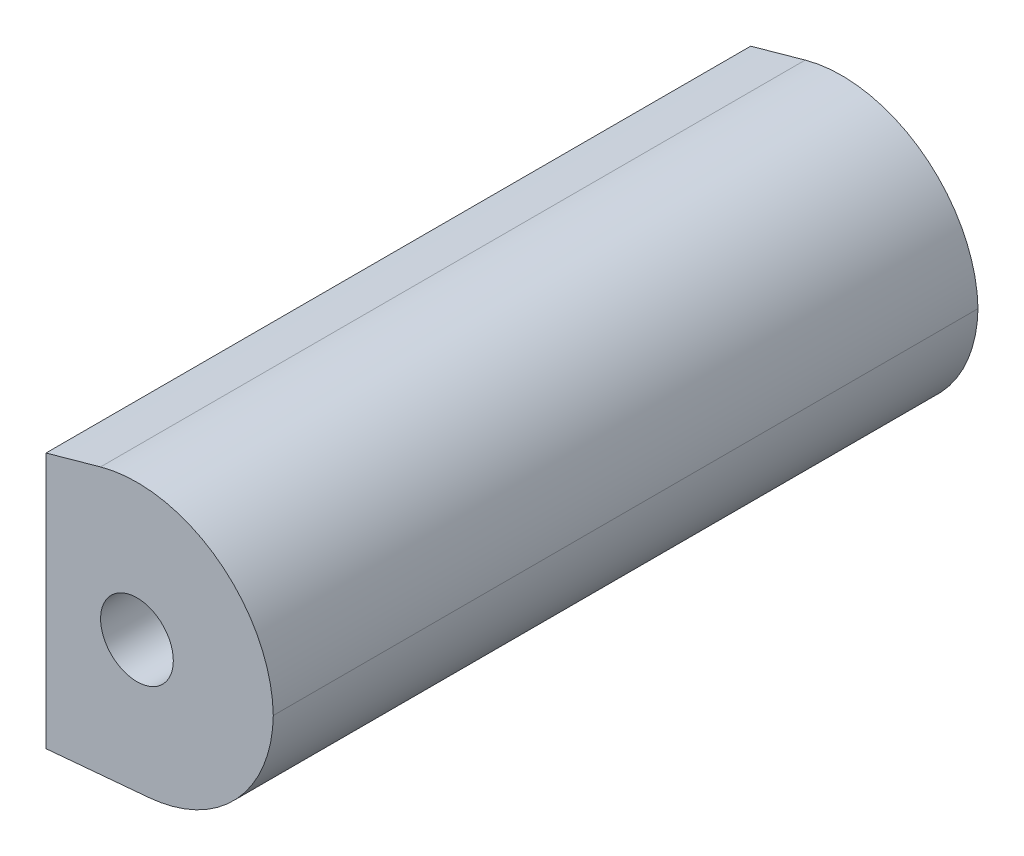
ISO-10303-21;
HEADER;
FILE_DESCRIPTION(('STEP AP214'),'2;1');
FILE_NAME('part.step','',(''),(''),'','','');
FILE_SCHEMA(('AUTOMOTIVE_DESIGN { 1 0 10303 214 1 1 1 1 }'));
ENDSEC;
DATA;
#1=APPLICATION_CONTEXT('core data for automotive mechanical design processes');
#2=APPLICATION_PROTOCOL_DEFINITION('international standard','automotive_design',2000,#1);
#3=PRODUCT_CONTEXT('',#1,'mechanical');
#4=PRODUCT('Part','Part','',(#3));
#5=PRODUCT_RELATED_PRODUCT_CATEGORY('part','',(#4));
#6=PRODUCT_DEFINITION_FORMATION('','',#4);
#7=PRODUCT_DEFINITION_CONTEXT('part definition',#1,'design');
#8=PRODUCT_DEFINITION('design','',#6,#7);
#9=PRODUCT_DEFINITION_SHAPE('','',#8);
#10=(LENGTH_UNIT() NAMED_UNIT(*) SI_UNIT(.MILLI.,.METRE.));
#11=(NAMED_UNIT(*) PLANE_ANGLE_UNIT() SI_UNIT($,.RADIAN.));
#12=(NAMED_UNIT(*) SI_UNIT($,.STERADIAN.) SOLID_ANGLE_UNIT());
#13=UNCERTAINTY_MEASURE_WITH_UNIT(LENGTH_MEASURE(1.E-05),#10,'distance_accuracy_value','');
#14=(GEOMETRIC_REPRESENTATION_CONTEXT(3) GLOBAL_UNCERTAINTY_ASSIGNED_CONTEXT((#13)) GLOBAL_UNIT_ASSIGNED_CONTEXT((#10,
#11,#12)) REPRESENTATION_CONTEXT('',''));
#15=CARTESIAN_POINT('',(0.,0.,0.));
#16=DIRECTION('',(0.,0.,1.));
#17=DIRECTION('',(1.,0.,0.));
#18=AXIS2_PLACEMENT_3D('',#15,#16,#17);
#19=CARTESIAN_POINT('',(-16.1561552730396,2.09294766279135,39.37));
#20=DIRECTION('',(0.,0.,-1.));
#21=DIRECTION('',(-1.,0.,0.));
#22=AXIS2_PLACEMENT_3D('',#19,#20,#21);
#23=PLANE('',#22);
#24=CARTESIAN_POINT('',(17.8990724415791,12.3877846203547,39.37));
#25=CARTESIAN_POINT('',(11.7790167256047,10.6925023401997,39.37));
#26=CARTESIAN_POINT('',(-2.95857416787217,6.43186852529945,39.37));
#27=CARTESIAN_POINT('',(-24.0802781594164,-0.40764875453386,39.37));
#28=CARTESIAN_POINT('',(-34.9936382099448,-4.73581500625607,39.37));
#29=CARTESIAN_POINT('',(-48.5373587126558,-9.63484988657126,39.37));
#30=CARTESIAN_POINT('',(-43.5667543838989,-9.1185130579212,39.37));
#31=B_SPLINE_CURVE_WITH_KNOTS('',3,(#24,#25,#26,#27,#28,#29,#30),.UNSPECIFIED.,.F.,.F.,(4,1,1,1,
4),(0.,0.0562610280461275,0.13357871929437,0.17988097810211,0.203822749471509),.UNSPECIFIED.);
#32=CARTESIAN_POINT('',(17.8990724415791,12.3877846203547,39.37));
#33=VERTEX_POINT('',#32);
#34=CARTESIAN_POINT('',(14.8518994230738,11.5374240393066,39.37));
#35=VERTEX_POINT('',#34);
#36=EDGE_CURVE('E101',#33,#35,#31,.T.);
#37=ORIENTED_EDGE('',*,*,#36,.T.);
#38=DIRECTION('',(0.,1.,0.));
#39=VECTOR('',#38,1.);
#40=CARTESIAN_POINT('',(14.8518994230738,23.2318443602349,39.37));
#41=LINE('',#40,#39);
#42=CARTESIAN_POINT('',(14.8518994230739,-2.76961363712004,39.37));
#43=VERTEX_POINT('',#42);
#44=EDGE_CURVE('E95',#43,#35,#41,.T.);
#45=ORIENTED_EDGE('',*,*,#44,.F.);
#46=CARTESIAN_POINT('',(-43.5667543838989,-9.1185130579212,39.37));
#47=CARTESIAN_POINT('',(-37.677273053983,-7.64768793504535,39.37));
#48=CARTESIAN_POINT('',(-27.7099480334527,-7.0246558315263,39.37));
#49=CARTESIAN_POINT('',(-9.98446347913125,-4.60428644123773,39.37));
#50=CARTESIAN_POINT('',(5.43321469344664,-3.69122975094768,39.37));
#51=CARTESIAN_POINT('',(16.9241190082548,-2.5678275045766,39.37));
#52=CARTESIAN_POINT('',(20.5342933669863,-2.26556299643368,39.37));
#53=CARTESIAN_POINT('',(20.5680251074916,-2.26274319297277,39.37));
#54=B_SPLINE_CURVE_WITH_KNOTS('',3,(#46,#47,#48,#49,#50,#51,#52,#53),.UNSPECIFIED.,.F.,.F.,(4,1,
1,1,1,4),(0.794337024705572,0.852124105685605,0.889611915980359,0.965358143172667,
0.999676326512797,1.),.UNSPECIFIED.);
#55=CARTESIAN_POINT('',(20.5680251074916,-2.26274319297277,39.37));
#56=VERTEX_POINT('',#55);
#57=EDGE_CURVE('E86',#43,#56,#54,.T.);
#58=ORIENTED_EDGE('',*,*,#57,.T.);
#59=CARTESIAN_POINT('',(19.9332456161012,5.33077081552883,39.37));
#60=DIRECTION('',(0.,0.,1.));
#61=DIRECTION('',(1.,0.,0.));
#62=AXIS2_PLACEMENT_3D('',#59,#60,#61);
#63=CIRCLE('',#62,7.62);
#64=CARTESIAN_POINT('',(27.5518994230738,5.1875431314007,39.37));
#65=VERTEX_POINT('',#64);
#66=EDGE_CURVE('E108',#56,#65,#63,.T.);
#67=ORIENTED_EDGE('',*,*,#66,.T.);
#68=CARTESIAN_POINT('',(19.9332456161012,5.04431544726942,39.37));
#69=DIRECTION('',(0.,0.,1.));
#70=DIRECTION('',(1.,0.,0.));
#71=AXIS2_PLACEMENT_3D('',#68,#69,#70);
#72=CIRCLE('',#71,7.62);
#73=EDGE_CURVE('E64',#65,#33,#72,.T.);
#74=ORIENTED_EDGE('',*,*,#73,.T.);
#75=EDGE_LOOP('',(#37,#45,#58,#67,#74));
#76=FACE_BOUND('',#75,.T.);
#77=CARTESIAN_POINT('',(19.9332456161012,5.04431544726942,39.37));
#78=DIRECTION('',(0.,0.,1.));
#79=DIRECTION('',(1.,0.,0.));
#80=AXIS2_PLACEMENT_3D('',#77,#78,#79);
#81=CIRCLE('',#80,2.03200000000001);
#82=CARTESIAN_POINT('',(21.9652456161012,5.04431544726942,39.37));
#83=VERTEX_POINT('',#82);
#84=EDGE_CURVE('E201',#83,#83,#81,.T.);
#85=ORIENTED_EDGE('',*,*,#84,.F.);
#86=EDGE_LOOP('',(#85));
#87=FACE_BOUND('',#86,.T.);
#88=ADVANCED_FACE('F39',(#76,#87),#23,.F.);
#89=CARTESIAN_POINT('',(-16.1561552730396,2.09294766279135,0.));
#90=DIRECTION('',(0.,0.,-1.));
#91=DIRECTION('',(-1.,0.,0.));
#92=AXIS2_PLACEMENT_3D('',#89,#90,#91);
#93=PLANE('',#92);
#94=DIRECTION('',(0.,1.,0.));
#95=VECTOR('',#94,1.);
#96=CARTESIAN_POINT('',(14.8518994230738,23.2318443602349,0.));
#97=LINE('',#96,#95);
#98=CARTESIAN_POINT('',(14.8518994326428,-2.76961363712005,0.));
#99=VERTEX_POINT('',#98);
#100=CARTESIAN_POINT('',(14.8518994230738,11.5374240393066,0.));
#101=VERTEX_POINT('',#100);
#102=EDGE_CURVE('E56',#99,#101,#97,.T.);
#103=ORIENTED_EDGE('',*,*,#102,.T.);
#104=CARTESIAN_POINT('',(17.8990724415791,12.3877846203547,0.));
#105=CARTESIAN_POINT('',(11.7790167256047,10.6925023401997,0.));
#106=CARTESIAN_POINT('',(-2.95857416787217,6.43186852529945,0.));
#107=CARTESIAN_POINT('',(-24.0802781594164,-0.40764875453386,0.));
#108=CARTESIAN_POINT('',(-34.9936382099448,-4.73581500625607,0.));
#109=CARTESIAN_POINT('',(-48.5373587126558,-9.63484988657126,0.));
#110=CARTESIAN_POINT('',(-43.5667543838989,-9.1185130579212,0.));
#111=B_SPLINE_CURVE_WITH_KNOTS('',3,(#104,#105,#106,#107,#108,#109,#110),.UNSPECIFIED.,.F.,.F.,
(4,1,1,1,4),(0.,0.0562610280461275,0.13357871929437,0.17988097810211,0.203822749471509),.UNSPECIFIED.);
#112=CARTESIAN_POINT('',(17.8990724415791,12.3877846203547,0.));
#113=VERTEX_POINT('',#112);
#114=EDGE_CURVE('E196',#113,#101,#111,.T.);
#115=ORIENTED_EDGE('',*,*,#114,.F.);
#116=CARTESIAN_POINT('',(19.9332456161012,5.04431544726942,0.));
#117=DIRECTION('',(0.,0.,1.));
#118=DIRECTION('',(1.,0.,0.));
#119=AXIS2_PLACEMENT_3D('',#116,#117,#118);
#120=CIRCLE('',#119,7.62);
#121=CARTESIAN_POINT('',(27.5518994230738,5.1875431314007,0.));
#122=VERTEX_POINT('',#121);
#123=EDGE_CURVE('E81',#122,#113,#120,.T.);
#124=ORIENTED_EDGE('',*,*,#123,.F.);
#125=CARTESIAN_POINT('',(19.9332456161012,5.33077081552883,0.));
#126=DIRECTION('',(0.,0.,1.));
#127=DIRECTION('',(1.,0.,0.));
#128=AXIS2_PLACEMENT_3D('',#125,#126,#127);
#129=CIRCLE('',#128,7.62);
#130=CARTESIAN_POINT('',(20.5680251074916,-2.26274319297277,0.));
#131=VERTEX_POINT('',#130);
#132=EDGE_CURVE('E205',#131,#122,#129,.T.);
#133=ORIENTED_EDGE('',*,*,#132,.F.);
#134=CARTESIAN_POINT('',(-43.5667543838989,-9.1185130579212,0.));
#135=CARTESIAN_POINT('',(-37.677273053983,-7.64768793504535,0.));
#136=CARTESIAN_POINT('',(-27.7099480334527,-7.0246558315263,0.));
#137=CARTESIAN_POINT('',(-9.98446347913125,-4.60428644123773,0.));
#138=CARTESIAN_POINT('',(5.43321469344664,-3.69122975094768,0.));
#139=CARTESIAN_POINT('',(16.9241190082548,-2.5678275045766,0.));
#140=CARTESIAN_POINT('',(20.5342933669863,-2.26556299643368,0.));
#141=CARTESIAN_POINT('',(20.5680251074916,-2.26274319297277,0.));
#142=B_SPLINE_CURVE_WITH_KNOTS('',3,(#134,#135,#136,#137,#138,#139,#140,#141),.UNSPECIFIED.,.F.,
.F.,(4,1,1,1,1,4),(0.794337024705572,0.852124105685605,0.889611915980359,0.965358143172667,
0.999676326512797,1.),.UNSPECIFIED.);
#143=EDGE_CURVE('E200',#99,#131,#142,.T.);
#144=ORIENTED_EDGE('',*,*,#143,.F.);
#145=EDGE_LOOP('',(#103,#115,#124,#133,#144));
#146=FACE_BOUND('',#145,.T.);
#147=CARTESIAN_POINT('',(19.9332456161012,5.04431544726942,0.));
#148=DIRECTION('',(0.,0.,1.));
#149=DIRECTION('',(1.,0.,0.));
#150=AXIS2_PLACEMENT_3D('',#147,#148,#149);
#151=CIRCLE('',#150,2.03200000000001);
#152=CARTESIAN_POINT('',(21.9652456161012,5.04431544726942,0.));
#153=VERTEX_POINT('',#152);
#154=EDGE_CURVE('E208',#153,#153,#151,.T.);
#155=ORIENTED_EDGE('',*,*,#154,.T.);
#156=EDGE_LOOP('',(#155));
#157=FACE_BOUND('',#156,.T.);
#158=ADVANCED_FACE('F134',(#146,#157),#93,.T.);
#159=DIRECTION('',(0.,0.,-1.));
#160=VECTOR('',#159,1.);
#161=SURFACE_OF_LINEAR_EXTRUSION('',#31,#160);
#162=ORIENTED_EDGE('',*,*,#114,.T.);
#163=DIRECTION('',(0.,0.,-1.));
#164=VECTOR('',#163,1.);
#165=CARTESIAN_POINT('',(14.8518994230738,11.5374240381905,39.37));
#166=LINE('',#165,#164);
#167=EDGE_CURVE('E197',#101,#35,#166,.F.);
#168=ORIENTED_EDGE('',*,*,#167,.T.);
#169=ORIENTED_EDGE('',*,*,#36,.F.);
#170=DIRECTION('',(0.,0.,-1.));
#171=VECTOR('',#170,1.);
#172=CARTESIAN_POINT('',(17.8990724415791,12.3877846203547,39.37));
#173=LINE('',#172,#171);
#174=EDGE_CURVE('E198',#33,#113,#173,.T.);
#175=ORIENTED_EDGE('',*,*,#174,.T.);
#176=EDGE_LOOP('',(#162,#168,#169,#175));
#177=FACE_BOUND('',#176,.T.);
#178=ADVANCED_FACE('F41',(#177),#161,.F.);
#179=DIRECTION('',(0.,0.,-1.));
#180=VECTOR('',#179,1.);
#181=SURFACE_OF_LINEAR_EXTRUSION('',#54,#180);
#182=ORIENTED_EDGE('',*,*,#57,.F.);
#183=DIRECTION('',(0.,0.,-1.));
#184=VECTOR('',#183,1.);
#185=CARTESIAN_POINT('',(14.8518994230738,-2.7696136379937,39.37));
#186=LINE('',#185,#184);
#187=EDGE_CURVE('E11',#43,#99,#186,.T.);
#188=ORIENTED_EDGE('',*,*,#187,.T.);
#189=ORIENTED_EDGE('',*,*,#143,.T.);
#190=DIRECTION('',(0.,0.,-1.));
#191=VECTOR('',#190,1.);
#192=CARTESIAN_POINT('',(20.5680251074916,-2.26274319297277,39.37));
#193=LINE('',#192,#191);
#194=EDGE_CURVE('E49',#56,#131,#193,.T.);
#195=ORIENTED_EDGE('',*,*,#194,.F.);
#196=EDGE_LOOP('',(#182,#188,#189,#195));
#197=FACE_BOUND('',#196,.T.);
#198=ADVANCED_FACE('F104',(#197),#181,.F.);
#199=CARTESIAN_POINT('',(19.9332456161012,5.33077081552883,39.37));
#200=DIRECTION('',(0.,0.,-1.));
#201=DIRECTION('',(-1.,0.,0.));
#202=AXIS2_PLACEMENT_3D('',#199,#200,#201);
#203=CYLINDRICAL_SURFACE('',#202,7.62);
#204=ORIENTED_EDGE('',*,*,#132,.T.);
#205=DIRECTION('',(0.,0.,-1.));
#206=VECTOR('',#205,1.);
#207=CARTESIAN_POINT('',(27.5518994230738,5.1875431314007,39.37));
#208=LINE('',#207,#206);
#209=EDGE_CURVE('E227',#65,#122,#208,.T.);
#210=ORIENTED_EDGE('',*,*,#209,.F.);
#211=ORIENTED_EDGE('',*,*,#66,.F.);
#212=ORIENTED_EDGE('',*,*,#194,.T.);
#213=EDGE_LOOP('',(#204,#210,#211,#212));
#214=FACE_BOUND('',#213,.T.);
#215=ADVANCED_FACE('F126',(#214),#203,.T.);
#216=CARTESIAN_POINT('',(19.9332456161012,5.04431544726942,39.37));
#217=DIRECTION('',(0.,0.,-1.));
#218=DIRECTION('',(-1.,0.,0.));
#219=AXIS2_PLACEMENT_3D('',#216,#217,#218);
#220=CYLINDRICAL_SURFACE('',#219,7.62);
#221=ORIENTED_EDGE('',*,*,#123,.T.);
#222=ORIENTED_EDGE('',*,*,#174,.F.);
#223=ORIENTED_EDGE('',*,*,#73,.F.);
#224=ORIENTED_EDGE('',*,*,#209,.T.);
#225=EDGE_LOOP('',(#221,#222,#223,#224));
#226=FACE_BOUND('',#225,.T.);
#227=ADVANCED_FACE('F129',(#226),#220,.T.);
#228=CARTESIAN_POINT('',(19.9332456161012,5.04431544726942,39.37));
#229=DIRECTION('',(0.,0.,-1.));
#230=DIRECTION('',(-1.,0.,0.));
#231=AXIS2_PLACEMENT_3D('',#228,#229,#230);
#232=CYLINDRICAL_SURFACE('',#231,2.03200000000001);
#233=ORIENTED_EDGE('',*,*,#84,.T.);
#234=EDGE_LOOP('',(#233));
#235=FACE_BOUND('',#234,.T.);
#236=ORIENTED_EDGE('',*,*,#154,.F.);
#237=EDGE_LOOP('',(#236));
#238=FACE_BOUND('',#237,.T.);
#239=ADVANCED_FACE('F133',(#235,#238),#232,.F.);
#240=CARTESIAN_POINT('',(14.8518994230738,23.2318443602349,0.));
#241=DIRECTION('',(1.,0.,0.));
#242=DIRECTION('',(0.,1.,0.));
#243=AXIS2_PLACEMENT_3D('',#240,#241,#242);
#244=PLANE('',#243);
#245=ORIENTED_EDGE('',*,*,#102,.F.);
#246=ORIENTED_EDGE('',*,*,#187,.F.);
#247=ORIENTED_EDGE('',*,*,#44,.T.);
#248=ORIENTED_EDGE('',*,*,#167,.F.);
#249=EDGE_LOOP('',(#245,#246,#247,#248));
#250=FACE_BOUND('',#249,.T.);
#251=ADVANCED_FACE('F94',(#250),#244,.F.);
#252=CLOSED_SHELL('',(#88,#158,#178,#198,#215,#227,#239,#251));
#253=MANIFOLD_SOLID_BREP('B2',#252);
#254=ADVANCED_BREP_SHAPE_REPRESENTATION('',(#18,#253),#14);
#255=SHAPE_DEFINITION_REPRESENTATION(#9,#254);
ENDSEC;
END-ISO-10303-21;
